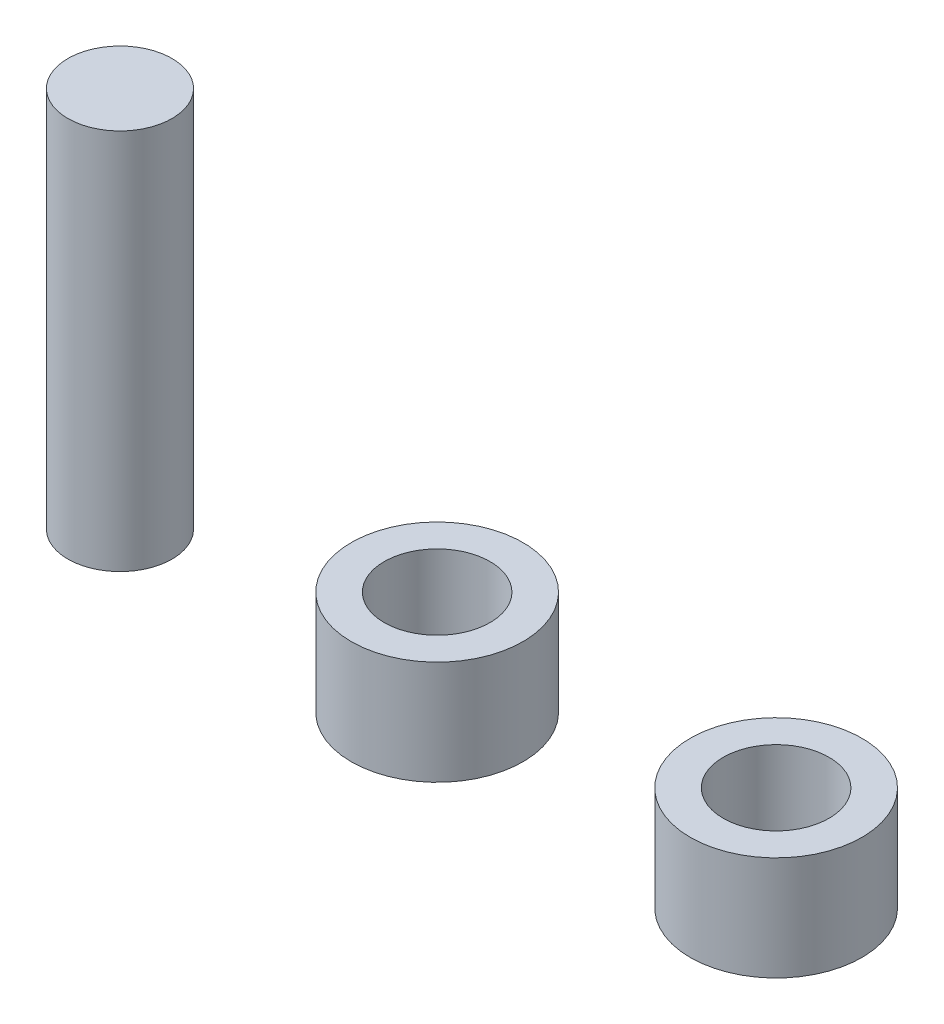
ISO-10303-21;
HEADER;
FILE_DESCRIPTION(('STEP AP214'),'2;1');
FILE_NAME('part.step','',(''),(''),'','','');
FILE_SCHEMA(('AUTOMOTIVE_DESIGN { 1 0 10303 214 1 1 1 1 }'));
ENDSEC;
DATA;
#1=APPLICATION_CONTEXT('core data for automotive mechanical design processes');
#2=APPLICATION_PROTOCOL_DEFINITION('international standard','automotive_design',2000,#1);
#3=PRODUCT_CONTEXT('',#1,'mechanical');
#4=PRODUCT('Part','Part','',(#3));
#5=PRODUCT_RELATED_PRODUCT_CATEGORY('part','',(#4));
#6=PRODUCT_DEFINITION_FORMATION('','',#4);
#7=PRODUCT_DEFINITION_CONTEXT('part definition',#1,'design');
#8=PRODUCT_DEFINITION('design','',#6,#7);
#9=PRODUCT_DEFINITION_SHAPE('','',#8);
#10=(LENGTH_UNIT() NAMED_UNIT(*) SI_UNIT(.MILLI.,.METRE.));
#11=(NAMED_UNIT(*) PLANE_ANGLE_UNIT() SI_UNIT($,.RADIAN.));
#12=(NAMED_UNIT(*) SI_UNIT($,.STERADIAN.) SOLID_ANGLE_UNIT());
#13=UNCERTAINTY_MEASURE_WITH_UNIT(LENGTH_MEASURE(1.E-05),#10,'distance_accuracy_value','');
#14=(GEOMETRIC_REPRESENTATION_CONTEXT(3) GLOBAL_UNCERTAINTY_ASSIGNED_CONTEXT((#13)) GLOBAL_UNIT_ASSIGNED_CONTEXT((#10,
#11,#12)) REPRESENTATION_CONTEXT('',''));
#15=CARTESIAN_POINT('',(0.,0.,0.));
#16=DIRECTION('',(0.,0.,1.));
#17=DIRECTION('',(1.,0.,0.));
#18=AXIS2_PLACEMENT_3D('',#15,#16,#17);
#19=CARTESIAN_POINT('',(9.88541352372916,3.,0.));
#20=DIRECTION('',(0.,1.,0.));
#21=DIRECTION('',(0.,0.,1.));
#22=AXIS2_PLACEMENT_3D('',#19,#20,#21);
#23=PLANE('',#22);
#24=CARTESIAN_POINT('',(9.88541352372916,3.,0.));
#25=DIRECTION('',(0.,-1.,0.));
#26=DIRECTION('',(0.,0.,1.));
#27=AXIS2_PLACEMENT_3D('',#24,#25,#26);
#28=CIRCLE('',#27,2.475);
#29=CARTESIAN_POINT('',(9.88541352372916,3.,2.475));
#30=VERTEX_POINT('',#29);
#31=EDGE_CURVE('E11',#30,#30,#28,.T.);
#32=ORIENTED_EDGE('',*,*,#31,.F.);
#33=EDGE_LOOP('',(#32));
#34=FACE_BOUND('',#33,.T.);
#35=CARTESIAN_POINT('',(9.88541352372916,3.,0.));
#36=DIRECTION('',(0.,-1.,0.));
#37=DIRECTION('',(0.,0.,1.));
#38=AXIS2_PLACEMENT_3D('',#35,#36,#37);
#39=CIRCLE('',#38,1.525);
#40=CARTESIAN_POINT('',(9.88541352372916,3.,1.525));
#41=VERTEX_POINT('',#40);
#42=EDGE_CURVE('E51',#41,#41,#39,.T.);
#43=ORIENTED_EDGE('',*,*,#42,.T.);
#44=EDGE_LOOP('',(#43));
#45=FACE_BOUND('',#44,.T.);
#46=ADVANCED_FACE('F40',(#34,#45),#23,.T.);
#47=CARTESIAN_POINT('',(9.88541352372916,0.,0.));
#48=DIRECTION('',(0.,1.,0.));
#49=DIRECTION('',(0.,0.,1.));
#50=AXIS2_PLACEMENT_3D('',#47,#48,#49);
#51=PLANE('',#50);
#52=CARTESIAN_POINT('',(9.88541352372916,0.,0.));
#53=DIRECTION('',(0.,-1.,0.));
#54=DIRECTION('',(0.,0.,1.));
#55=AXIS2_PLACEMENT_3D('',#52,#53,#54);
#56=CIRCLE('',#55,2.475);
#57=CARTESIAN_POINT('',(9.88541352372916,0.,2.475));
#58=VERTEX_POINT('',#57);
#59=EDGE_CURVE('E44',#58,#58,#56,.T.);
#60=ORIENTED_EDGE('',*,*,#59,.T.);
#61=EDGE_LOOP('',(#60));
#62=FACE_BOUND('',#61,.T.);
#63=CARTESIAN_POINT('',(9.88541352372916,0.,0.));
#64=DIRECTION('',(0.,-1.,0.));
#65=DIRECTION('',(0.,0.,1.));
#66=AXIS2_PLACEMENT_3D('',#63,#64,#65);
#67=CIRCLE('',#66,1.525);
#68=CARTESIAN_POINT('',(9.88541352372916,0.,1.525));
#69=VERTEX_POINT('',#68);
#70=EDGE_CURVE('E53',#69,#69,#67,.T.);
#71=ORIENTED_EDGE('',*,*,#70,.F.);
#72=EDGE_LOOP('',(#71));
#73=FACE_BOUND('',#72,.T.);
#74=ADVANCED_FACE('F66',(#62,#73),#51,.F.);
#75=CARTESIAN_POINT('',(9.88541352372916,3.,0.));
#76=DIRECTION('',(0.,-1.,0.));
#77=DIRECTION('',(0.,0.,-1.));
#78=AXIS2_PLACEMENT_3D('',#75,#76,#77);
#79=CYLINDRICAL_SURFACE('',#78,2.475);
#80=ORIENTED_EDGE('',*,*,#31,.T.);
#81=EDGE_LOOP('',(#80));
#82=FACE_BOUND('',#81,.T.);
#83=ORIENTED_EDGE('',*,*,#59,.F.);
#84=EDGE_LOOP('',(#83));
#85=FACE_BOUND('',#84,.T.);
#86=ADVANCED_FACE('F42',(#82,#85),#79,.T.);
#87=CARTESIAN_POINT('',(9.88541352372916,3.,0.));
#88=DIRECTION('',(0.,-1.,0.));
#89=DIRECTION('',(0.,0.,-1.));
#90=AXIS2_PLACEMENT_3D('',#87,#88,#89);
#91=CYLINDRICAL_SURFACE('',#90,1.525);
#92=ORIENTED_EDGE('',*,*,#42,.F.);
#93=EDGE_LOOP('',(#92));
#94=FACE_BOUND('',#93,.T.);
#95=ORIENTED_EDGE('',*,*,#70,.T.);
#96=EDGE_LOOP('',(#95));
#97=FACE_BOUND('',#96,.T.);
#98=ADVANCED_FACE('F60',(#94,#97),#91,.F.);
#99=CLOSED_SHELL('',(#46,#74,#86,#98));
#100=MANIFOLD_SOLID_BREP('B2',#99);
#101=CARTESIAN_POINT('',(-9.0272965862901,11.,0.));
#102=DIRECTION('',(0.,-1.,0.));
#103=DIRECTION('',(0.,0.,-1.));
#104=AXIS2_PLACEMENT_3D('',#101,#102,#103);
#105=CYLINDRICAL_SURFACE('',#104,1.5);
#106=CARTESIAN_POINT('',(-9.0272965862901,11.,0.));
#107=DIRECTION('',(0.,1.,0.));
#108=DIRECTION('',(0.,0.,1.));
#109=AXIS2_PLACEMENT_3D('',#106,#107,#108);
#110=CIRCLE('',#109,1.5);
#111=CARTESIAN_POINT('',(-9.0272965862901,11.,1.5));
#112=VERTEX_POINT('',#111);
#113=EDGE_CURVE('E39',#112,#112,#110,.T.);
#114=ORIENTED_EDGE('',*,*,#113,.F.);
#115=EDGE_LOOP('',(#114));
#116=FACE_BOUND('',#115,.T.);
#117=CARTESIAN_POINT('',(-9.0272965862901,0.,0.));
#118=DIRECTION('',(0.,1.,0.));
#119=DIRECTION('',(0.,0.,1.));
#120=AXIS2_PLACEMENT_3D('',#117,#118,#119);
#121=CIRCLE('',#120,1.5);
#122=CARTESIAN_POINT('',(-9.0272965862901,0.,1.5));
#123=VERTEX_POINT('',#122);
#124=EDGE_CURVE('E112',#123,#123,#121,.T.);
#125=ORIENTED_EDGE('',*,*,#124,.T.);
#126=EDGE_LOOP('',(#125));
#127=FACE_BOUND('',#126,.T.);
#128=ADVANCED_FACE('F109',(#116,#127),#105,.T.);
#129=CARTESIAN_POINT('',(-9.0272965862901,11.,0.));
#130=DIRECTION('',(0.,1.,0.));
#131=DIRECTION('',(0.,0.,1.));
#132=AXIS2_PLACEMENT_3D('',#129,#130,#131);
#133=PLANE('',#132);
#134=ORIENTED_EDGE('',*,*,#113,.T.);
#135=EDGE_LOOP('',(#134));
#136=FACE_BOUND('',#135,.T.);
#137=ADVANCED_FACE('F124',(#136),#133,.T.);
#138=CARTESIAN_POINT('',(-9.0272965862901,0.,0.));
#139=DIRECTION('',(0.,1.,0.));
#140=DIRECTION('',(0.,0.,1.));
#141=AXIS2_PLACEMENT_3D('',#138,#139,#140);
#142=PLANE('',#141);
#143=ORIENTED_EDGE('',*,*,#124,.F.);
#144=EDGE_LOOP('',(#143));
#145=FACE_BOUND('',#144,.T.);
#146=ADVANCED_FACE('F122',(#145),#142,.F.);
#147=CLOSED_SHELL('',(#128,#137,#146));
#148=MANIFOLD_SOLID_BREP('B6',#147);
#149=CARTESIAN_POINT('',(0.11458647627084,3.,0.));
#150=DIRECTION('',(0.,1.,0.));
#151=DIRECTION('',(0.,0.,1.));
#152=AXIS2_PLACEMENT_3D('',#149,#150,#151);
#153=PLANE('',#152);
#154=CARTESIAN_POINT('',(0.11458647627084,3.,0.));
#155=DIRECTION('',(0.,1.,0.));
#156=DIRECTION('',(0.,0.,1.));
#157=AXIS2_PLACEMENT_3D('',#154,#155,#156);
#158=CIRCLE('',#157,2.475);
#159=CARTESIAN_POINT('',(0.11458647627084,3.,2.475));
#160=VERTEX_POINT('',#159);
#161=EDGE_CURVE('E108',#160,#160,#158,.T.);
#162=ORIENTED_EDGE('',*,*,#161,.T.);
#163=EDGE_LOOP('',(#162));
#164=FACE_BOUND('',#163,.T.);
#165=CARTESIAN_POINT('',(0.11458647627084,3.,0.));
#166=DIRECTION('',(0.,1.,0.));
#167=DIRECTION('',(0.,0.,1.));
#168=AXIS2_PLACEMENT_3D('',#165,#166,#167);
#169=CIRCLE('',#168,1.525);
#170=CARTESIAN_POINT('',(0.11458647627084,3.,1.525));
#171=VERTEX_POINT('',#170);
#172=EDGE_CURVE('E161',#171,#171,#169,.T.);
#173=ORIENTED_EDGE('',*,*,#172,.F.);
#174=EDGE_LOOP('',(#173));
#175=FACE_BOUND('',#174,.T.);
#176=ADVANCED_FACE('F150',(#164,#175),#153,.T.);
#177=CARTESIAN_POINT('',(0.11458647627084,0.,0.));
#178=DIRECTION('',(0.,1.,0.));
#179=DIRECTION('',(0.,0.,1.));
#180=AXIS2_PLACEMENT_3D('',#177,#178,#179);
#181=PLANE('',#180);
#182=CARTESIAN_POINT('',(0.11458647627084,0.,0.));
#183=DIRECTION('',(0.,1.,0.));
#184=DIRECTION('',(0.,0.,1.));
#185=AXIS2_PLACEMENT_3D('',#182,#183,#184);
#186=CIRCLE('',#185,2.475);
#187=CARTESIAN_POINT('',(0.11458647627084,0.,2.475));
#188=VERTEX_POINT('',#187);
#189=EDGE_CURVE('E154',#188,#188,#186,.T.);
#190=ORIENTED_EDGE('',*,*,#189,.F.);
#191=EDGE_LOOP('',(#190));
#192=FACE_BOUND('',#191,.T.);
#193=CARTESIAN_POINT('',(0.11458647627084,0.,0.));
#194=DIRECTION('',(0.,1.,0.));
#195=DIRECTION('',(0.,0.,1.));
#196=AXIS2_PLACEMENT_3D('',#193,#194,#195);
#197=CIRCLE('',#196,1.525);
#198=CARTESIAN_POINT('',(0.11458647627084,0.,1.525));
#199=VERTEX_POINT('',#198);
#200=EDGE_CURVE('E163',#199,#199,#197,.T.);
#201=ORIENTED_EDGE('',*,*,#200,.T.);
#202=EDGE_LOOP('',(#201));
#203=FACE_BOUND('',#202,.T.);
#204=ADVANCED_FACE('F173',(#192,#203),#181,.F.);
#205=CARTESIAN_POINT('',(0.11458647627084,3.,0.));
#206=DIRECTION('',(0.,-1.,0.));
#207=DIRECTION('',(0.,0.,-1.));
#208=AXIS2_PLACEMENT_3D('',#205,#206,#207);
#209=CYLINDRICAL_SURFACE('',#208,2.475);
#210=ORIENTED_EDGE('',*,*,#161,.F.);
#211=EDGE_LOOP('',(#210));
#212=FACE_BOUND('',#211,.T.);
#213=ORIENTED_EDGE('',*,*,#189,.T.);
#214=EDGE_LOOP('',(#213));
#215=FACE_BOUND('',#214,.T.);
#216=ADVANCED_FACE('F152',(#212,#215),#209,.T.);
#217=CARTESIAN_POINT('',(0.11458647627084,3.,0.));
#218=DIRECTION('',(0.,-1.,0.));
#219=DIRECTION('',(0.,0.,-1.));
#220=AXIS2_PLACEMENT_3D('',#217,#218,#219);
#221=CYLINDRICAL_SURFACE('',#220,1.525);
#222=ORIENTED_EDGE('',*,*,#172,.T.);
#223=EDGE_LOOP('',(#222));
#224=FACE_BOUND('',#223,.T.);
#225=ORIENTED_EDGE('',*,*,#200,.F.);
#226=EDGE_LOOP('',(#225));
#227=FACE_BOUND('',#226,.T.);
#228=ADVANCED_FACE('F169',(#224,#227),#221,.F.);
#229=CLOSED_SHELL('',(#176,#204,#216,#228));
#230=MANIFOLD_SOLID_BREP('B34',#229);
#231=ADVANCED_BREP_SHAPE_REPRESENTATION('',(#18,#100,#148,#230),#14);
#232=SHAPE_DEFINITION_REPRESENTATION(#9,#231);
ENDSEC;
END-ISO-10303-21;
